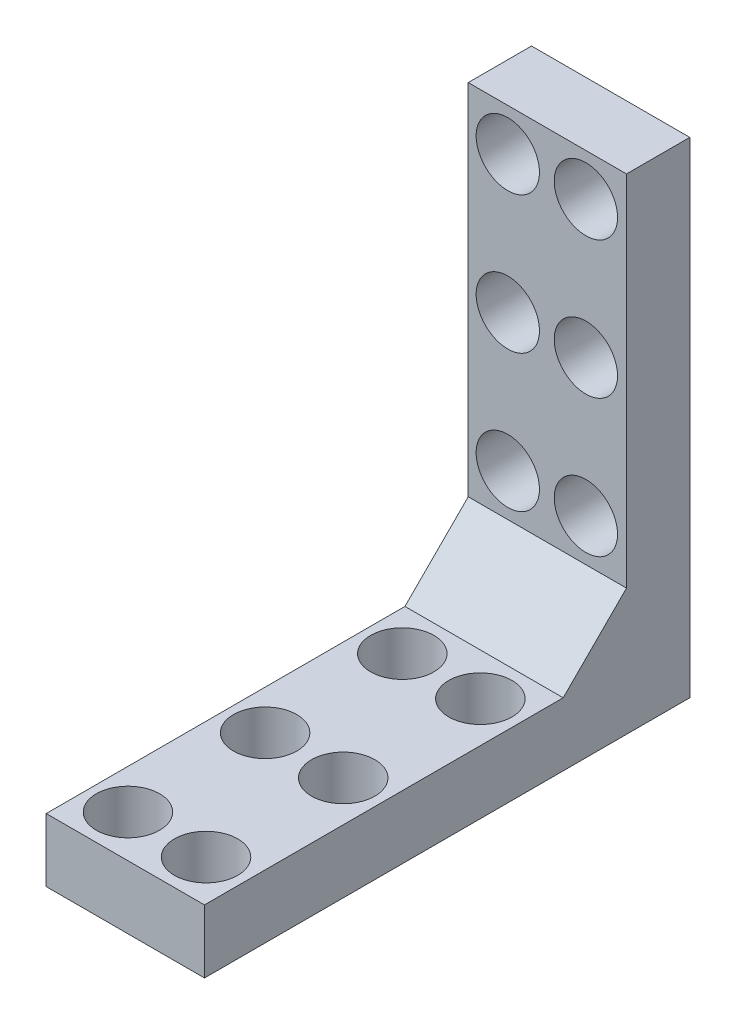
ISO-10303-21;
HEADER;
FILE_DESCRIPTION(('STEP AP214'),'2;1');
FILE_NAME('part.step','',(''),(''),'','','');
FILE_SCHEMA(('AUTOMOTIVE_DESIGN { 1 0 10303 214 1 1 1 1 }'));
ENDSEC;
DATA;
#1=APPLICATION_CONTEXT('core data for automotive mechanical design processes');
#2=APPLICATION_PROTOCOL_DEFINITION('international standard','automotive_design',2000,#1);
#3=PRODUCT_CONTEXT('',#1,'mechanical');
#4=PRODUCT('Part','Part','',(#3));
#5=PRODUCT_RELATED_PRODUCT_CATEGORY('part','',(#4));
#6=PRODUCT_DEFINITION_FORMATION('','',#4);
#7=PRODUCT_DEFINITION_CONTEXT('part definition',#1,'design');
#8=PRODUCT_DEFINITION('design','',#6,#7);
#9=PRODUCT_DEFINITION_SHAPE('','',#8);
#10=(LENGTH_UNIT() NAMED_UNIT(*) SI_UNIT(.MILLI.,.METRE.));
#11=(NAMED_UNIT(*) PLANE_ANGLE_UNIT() SI_UNIT($,.RADIAN.));
#12=(NAMED_UNIT(*) SI_UNIT($,.STERADIAN.) SOLID_ANGLE_UNIT());
#13=UNCERTAINTY_MEASURE_WITH_UNIT(LENGTH_MEASURE(1.E-05),#10,'distance_accuracy_value','');
#14=(GEOMETRIC_REPRESENTATION_CONTEXT(3) GLOBAL_UNCERTAINTY_ASSIGNED_CONTEXT((#13)) GLOBAL_UNIT_ASSIGNED_CONTEXT((#10,
#11,#12)) REPRESENTATION_CONTEXT('',''));
#15=CARTESIAN_POINT('',(0.,0.,0.));
#16=DIRECTION('',(0.,0.,1.));
#17=DIRECTION('',(1.,0.,0.));
#18=AXIS2_PLACEMENT_3D('',#15,#16,#17);
#19=CARTESIAN_POINT('',(5.575,-7.,-15.));
#20=DIRECTION('',(0.,1.,0.));
#21=DIRECTION('',(0.,0.,1.));
#22=AXIS2_PLACEMENT_3D('',#19,#20,#21);
#23=CYLINDRICAL_SURFACE('',#22,1.5);
#24=CARTESIAN_POINT('',(5.575,3.,-15.));
#25=DIRECTION('',(0.,1.,0.));
#26=DIRECTION('',(0.,0.,1.));
#27=AXIS2_PLACEMENT_3D('',#24,#25,#26);
#28=CIRCLE('',#27,1.5);
#29=CARTESIAN_POINT('',(5.575,3.,-13.5));
#30=VERTEX_POINT('',#29);
#31=EDGE_CURVE('E48',#30,#30,#28,.T.);
#32=ORIENTED_EDGE('',*,*,#31,.T.);
#33=EDGE_LOOP('',(#32));
#34=FACE_BOUND('',#33,.T.);
#35=CARTESIAN_POINT('',(5.575,0.,-15.));
#36=DIRECTION('',(0.,1.,0.));
#37=DIRECTION('',(0.,0.,1.));
#38=AXIS2_PLACEMENT_3D('',#35,#36,#37);
#39=CIRCLE('',#38,1.5);
#40=CARTESIAN_POINT('',(5.575,0.,-13.5));
#41=VERTEX_POINT('',#40);
#42=EDGE_CURVE('E11',#41,#41,#39,.T.);
#43=ORIENTED_EDGE('',*,*,#42,.F.);
#44=EDGE_LOOP('',(#43));
#45=FACE_BOUND('',#44,.T.);
#46=ADVANCED_FACE('F41',(#34,#45),#23,.F.);
#47=CARTESIAN_POINT('',(1.875,-7.,-15.));
#48=DIRECTION('',(0.,1.,0.));
#49=DIRECTION('',(0.,0.,1.));
#50=AXIS2_PLACEMENT_3D('',#47,#48,#49);
#51=CYLINDRICAL_SURFACE('',#50,1.5);
#52=CARTESIAN_POINT('',(1.875,3.,-15.));
#53=DIRECTION('',(0.,1.,0.));
#54=DIRECTION('',(0.,0.,1.));
#55=AXIS2_PLACEMENT_3D('',#52,#53,#54);
#56=CIRCLE('',#55,1.5);
#57=CARTESIAN_POINT('',(1.875,3.,-13.5));
#58=VERTEX_POINT('',#57);
#59=EDGE_CURVE('E176',#58,#58,#56,.T.);
#60=ORIENTED_EDGE('',*,*,#59,.T.);
#61=EDGE_LOOP('',(#60));
#62=FACE_BOUND('',#61,.T.);
#63=CARTESIAN_POINT('',(1.875,0.,-15.));
#64=DIRECTION('',(0.,1.,0.));
#65=DIRECTION('',(0.,0.,1.));
#66=AXIS2_PLACEMENT_3D('',#63,#64,#65);
#67=CIRCLE('',#66,1.5);
#68=CARTESIAN_POINT('',(1.875,0.,-13.5));
#69=VERTEX_POINT('',#68);
#70=EDGE_CURVE('E177',#69,#69,#67,.T.);
#71=ORIENTED_EDGE('',*,*,#70,.F.);
#72=EDGE_LOOP('',(#71));
#73=FACE_BOUND('',#72,.T.);
#74=ADVANCED_FACE('F206',(#62,#73),#51,.F.);
#75=CARTESIAN_POINT('',(5.575,-7.,-8.5));
#76=DIRECTION('',(0.,1.,0.));
#77=DIRECTION('',(0.,0.,1.));
#78=AXIS2_PLACEMENT_3D('',#75,#76,#77);
#79=CYLINDRICAL_SURFACE('',#78,1.5);
#80=CARTESIAN_POINT('',(5.575,3.,-8.5));
#81=DIRECTION('',(0.,1.,0.));
#82=DIRECTION('',(0.,0.,1.));
#83=AXIS2_PLACEMENT_3D('',#80,#81,#82);
#84=CIRCLE('',#83,1.5);
#85=CARTESIAN_POINT('',(5.575,3.,-7.));
#86=VERTEX_POINT('',#85);
#87=EDGE_CURVE('E168',#86,#86,#84,.T.);
#88=ORIENTED_EDGE('',*,*,#87,.T.);
#89=EDGE_LOOP('',(#88));
#90=FACE_BOUND('',#89,.T.);
#91=CARTESIAN_POINT('',(5.575,0.,-8.5));
#92=DIRECTION('',(0.,1.,0.));
#93=DIRECTION('',(0.,0.,1.));
#94=AXIS2_PLACEMENT_3D('',#91,#92,#93);
#95=CIRCLE('',#94,1.5);
#96=CARTESIAN_POINT('',(5.575,0.,-7.));
#97=VERTEX_POINT('',#96);
#98=EDGE_CURVE('E173',#97,#97,#95,.T.);
#99=ORIENTED_EDGE('',*,*,#98,.F.);
#100=EDGE_LOOP('',(#99));
#101=FACE_BOUND('',#100,.T.);
#102=ADVANCED_FACE('F211',(#90,#101),#79,.F.);
#103=CARTESIAN_POINT('',(1.875,-7.,-8.5));
#104=DIRECTION('',(0.,1.,0.));
#105=DIRECTION('',(0.,0.,1.));
#106=AXIS2_PLACEMENT_3D('',#103,#104,#105);
#107=CYLINDRICAL_SURFACE('',#106,1.5);
#108=CARTESIAN_POINT('',(1.875,3.,-8.5));
#109=DIRECTION('',(0.,1.,0.));
#110=DIRECTION('',(0.,0.,1.));
#111=AXIS2_PLACEMENT_3D('',#108,#109,#110);
#112=CIRCLE('',#111,1.5);
#113=CARTESIAN_POINT('',(1.875,3.,-7.));
#114=VERTEX_POINT('',#113);
#115=EDGE_CURVE('E163',#114,#114,#112,.T.);
#116=ORIENTED_EDGE('',*,*,#115,.T.);
#117=EDGE_LOOP('',(#116));
#118=FACE_BOUND('',#117,.T.);
#119=CARTESIAN_POINT('',(1.875,0.,-8.5));
#120=DIRECTION('',(0.,1.,0.));
#121=DIRECTION('',(0.,0.,1.));
#122=AXIS2_PLACEMENT_3D('',#119,#120,#121);
#123=CIRCLE('',#122,1.5);
#124=CARTESIAN_POINT('',(1.875,0.,-7.));
#125=VERTEX_POINT('',#124);
#126=EDGE_CURVE('E170',#125,#125,#123,.T.);
#127=ORIENTED_EDGE('',*,*,#126,.F.);
#128=EDGE_LOOP('',(#127));
#129=FACE_BOUND('',#128,.T.);
#130=ADVANCED_FACE('F216',(#118,#129),#107,.F.);
#131=CARTESIAN_POINT('',(5.575,8.,-30.));
#132=DIRECTION('',(0.,0.,1.));
#133=DIRECTION('',(1.,0.,0.));
#134=AXIS2_PLACEMENT_3D('',#131,#132,#133);
#135=CYLINDRICAL_SURFACE('',#134,1.5);
#136=CARTESIAN_POINT('',(5.575,8.,-20.));
#137=DIRECTION('',(0.,0.,1.));
#138=DIRECTION('',(1.,0.,0.));
#139=AXIS2_PLACEMENT_3D('',#136,#137,#138);
#140=CIRCLE('',#139,1.5);
#141=CARTESIAN_POINT('',(7.075,8.,-20.));
#142=VERTEX_POINT('',#141);
#143=EDGE_CURVE('E158',#142,#142,#140,.T.);
#144=ORIENTED_EDGE('',*,*,#143,.T.);
#145=EDGE_LOOP('',(#144));
#146=FACE_BOUND('',#145,.T.);
#147=CARTESIAN_POINT('',(5.575,8.,-23.));
#148=DIRECTION('',(0.,0.,1.));
#149=DIRECTION('',(0.,-1.,0.));
#150=AXIS2_PLACEMENT_3D('',#147,#148,#149);
#151=CIRCLE('',#150,1.5);
#152=CARTESIAN_POINT('',(5.575,6.5,-23.));
#153=VERTEX_POINT('',#152);
#154=EDGE_CURVE('E161',#153,#153,#151,.T.);
#155=ORIENTED_EDGE('',*,*,#154,.F.);
#156=EDGE_LOOP('',(#155));
#157=FACE_BOUND('',#156,.T.);
#158=ADVANCED_FACE('F224',(#146,#157),#135,.F.);
#159=CARTESIAN_POINT('',(1.875,8.,-30.));
#160=DIRECTION('',(0.,0.,1.));
#161=DIRECTION('',(1.,0.,0.));
#162=AXIS2_PLACEMENT_3D('',#159,#160,#161);
#163=CYLINDRICAL_SURFACE('',#162,1.5);
#164=CARTESIAN_POINT('',(1.875,8.,-20.));
#165=DIRECTION('',(0.,0.,1.));
#166=DIRECTION('',(1.,0.,0.));
#167=AXIS2_PLACEMENT_3D('',#164,#165,#166);
#168=CIRCLE('',#167,1.5);
#169=CARTESIAN_POINT('',(3.375,8.,-20.));
#170=VERTEX_POINT('',#169);
#171=EDGE_CURVE('E155',#170,#170,#168,.T.);
#172=ORIENTED_EDGE('',*,*,#171,.T.);
#173=EDGE_LOOP('',(#172));
#174=FACE_BOUND('',#173,.T.);
#175=CARTESIAN_POINT('',(1.875,8.,-23.));
#176=DIRECTION('',(0.,0.,1.));
#177=DIRECTION('',(0.,-1.,0.));
#178=AXIS2_PLACEMENT_3D('',#175,#176,#177);
#179=CIRCLE('',#178,1.5);
#180=CARTESIAN_POINT('',(1.875,6.5,-23.));
#181=VERTEX_POINT('',#180);
#182=EDGE_CURVE('E154',#181,#181,#179,.T.);
#183=ORIENTED_EDGE('',*,*,#182,.F.);
#184=EDGE_LOOP('',(#183));
#185=FACE_BOUND('',#184,.T.);
#186=ADVANCED_FACE('F230',(#174,#185),#163,.F.);
#187=CARTESIAN_POINT('',(5.575,14.5,-30.));
#188=DIRECTION('',(0.,0.,1.));
#189=DIRECTION('',(1.,0.,0.));
#190=AXIS2_PLACEMENT_3D('',#187,#188,#189);
#191=CYLINDRICAL_SURFACE('',#190,1.5);
#192=CARTESIAN_POINT('',(5.575,14.5,-20.));
#193=DIRECTION('',(0.,0.,1.));
#194=DIRECTION('',(1.,0.,0.));
#195=AXIS2_PLACEMENT_3D('',#192,#193,#194);
#196=CIRCLE('',#195,1.5);
#197=CARTESIAN_POINT('',(7.075,14.5,-20.));
#198=VERTEX_POINT('',#197);
#199=EDGE_CURVE('E148',#198,#198,#196,.T.);
#200=ORIENTED_EDGE('',*,*,#199,.T.);
#201=EDGE_LOOP('',(#200));
#202=FACE_BOUND('',#201,.T.);
#203=CARTESIAN_POINT('',(5.575,14.5,-23.));
#204=DIRECTION('',(0.,0.,1.));
#205=DIRECTION('',(0.,-1.,0.));
#206=AXIS2_PLACEMENT_3D('',#203,#204,#205);
#207=CIRCLE('',#206,1.5);
#208=CARTESIAN_POINT('',(5.575,13.,-23.));
#209=VERTEX_POINT('',#208);
#210=EDGE_CURVE('E149',#209,#209,#207,.T.);
#211=ORIENTED_EDGE('',*,*,#210,.F.);
#212=EDGE_LOOP('',(#211));
#213=FACE_BOUND('',#212,.T.);
#214=ADVANCED_FACE('F231',(#202,#213),#191,.F.);
#215=CARTESIAN_POINT('',(1.875,14.5,-30.));
#216=DIRECTION('',(0.,0.,1.));
#217=DIRECTION('',(1.,0.,0.));
#218=AXIS2_PLACEMENT_3D('',#215,#216,#217);
#219=CYLINDRICAL_SURFACE('',#218,1.5);
#220=CARTESIAN_POINT('',(1.875,14.5,-20.));
#221=DIRECTION('',(0.,0.,1.));
#222=DIRECTION('',(1.,0.,0.));
#223=AXIS2_PLACEMENT_3D('',#220,#221,#222);
#224=CIRCLE('',#223,1.5);
#225=CARTESIAN_POINT('',(3.375,14.5,-20.));
#226=VERTEX_POINT('',#225);
#227=EDGE_CURVE('E139',#226,#226,#224,.T.);
#228=ORIENTED_EDGE('',*,*,#227,.T.);
#229=EDGE_LOOP('',(#228));
#230=FACE_BOUND('',#229,.T.);
#231=CARTESIAN_POINT('',(1.875,14.5,-23.));
#232=DIRECTION('',(0.,0.,1.));
#233=DIRECTION('',(0.,-1.,0.));
#234=AXIS2_PLACEMENT_3D('',#231,#232,#233);
#235=CIRCLE('',#234,1.5);
#236=CARTESIAN_POINT('',(1.875,13.,-23.));
#237=VERTEX_POINT('',#236);
#238=EDGE_CURVE('E141',#237,#237,#235,.T.);
#239=ORIENTED_EDGE('',*,*,#238,.F.);
#240=EDGE_LOOP('',(#239));
#241=FACE_BOUND('',#240,.T.);
#242=ADVANCED_FACE('F234',(#230,#241),#219,.F.);
#243=CARTESIAN_POINT('',(7.5,0.,0.));
#244=DIRECTION('',(0.,1.,0.));
#245=DIRECTION('',(0.,0.,1.));
#246=AXIS2_PLACEMENT_3D('',#243,#244,#245);
#247=PLANE('',#246);
#248=CARTESIAN_POINT('',(5.575,0.,-2.));
#249=DIRECTION('',(0.,1.,0.));
#250=DIRECTION('',(0.,0.,1.));
#251=AXIS2_PLACEMENT_3D('',#248,#249,#250);
#252=CIRCLE('',#251,1.5);
#253=CARTESIAN_POINT('',(5.575,0.,-0.5));
#254=VERTEX_POINT('',#253);
#255=EDGE_CURVE('E308',#254,#254,#252,.T.);
#256=ORIENTED_EDGE('',*,*,#255,.T.);
#257=EDGE_LOOP('',(#256));
#258=FACE_BOUND('',#257,.T.);
#259=CARTESIAN_POINT('',(1.875,0.,-2.));
#260=DIRECTION('',(0.,1.,0.));
#261=DIRECTION('',(0.,0.,1.));
#262=AXIS2_PLACEMENT_3D('',#259,#260,#261);
#263=CIRCLE('',#262,1.5);
#264=CARTESIAN_POINT('',(1.875,0.,-0.5));
#265=VERTEX_POINT('',#264);
#266=EDGE_CURVE('E294',#265,#265,#263,.T.);
#267=ORIENTED_EDGE('',*,*,#266,.T.);
#268=EDGE_LOOP('',(#267));
#269=FACE_BOUND('',#268,.T.);
#270=DIRECTION('',(0.,0.,-1.));
#271=VECTOR('',#270,1.);
#272=CARTESIAN_POINT('',(0.,0.,0.));
#273=LINE('',#272,#271);
#274=CARTESIAN_POINT('',(0.,0.,0.));
#275=VERTEX_POINT('',#274);
#276=CARTESIAN_POINT('',(0.,0.,-23.));
#277=VERTEX_POINT('',#276);
#278=EDGE_CURVE('E130',#275,#277,#273,.T.);
#279=ORIENTED_EDGE('',*,*,#278,.T.);
#280=DIRECTION('',(-1.,0.,0.));
#281=VECTOR('',#280,1.);
#282=CARTESIAN_POINT('',(7.5,0.,-23.));
#283=LINE('',#282,#281);
#284=CARTESIAN_POINT('',(7.5,0.,-23.));
#285=VERTEX_POINT('',#284);
#286=EDGE_CURVE('E106',#285,#277,#283,.T.);
#287=ORIENTED_EDGE('',*,*,#286,.F.);
#288=DIRECTION('',(0.,0.,-1.));
#289=VECTOR('',#288,1.);
#290=CARTESIAN_POINT('',(7.5,0.,0.));
#291=LINE('',#290,#289);
#292=CARTESIAN_POINT('',(7.5,0.,0.));
#293=VERTEX_POINT('',#292);
#294=EDGE_CURVE('E114',#293,#285,#291,.T.);
#295=ORIENTED_EDGE('',*,*,#294,.F.);
#296=DIRECTION('',(-1.,0.,0.));
#297=VECTOR('',#296,1.);
#298=CARTESIAN_POINT('',(7.5,0.,0.));
#299=LINE('',#298,#297);
#300=EDGE_CURVE('E273',#293,#275,#299,.T.);
#301=ORIENTED_EDGE('',*,*,#300,.T.);
#302=EDGE_LOOP('',(#279,#287,#295,#301));
#303=FACE_BOUND('',#302,.T.);
#304=ORIENTED_EDGE('',*,*,#126,.T.);
#305=EDGE_LOOP('',(#304));
#306=FACE_BOUND('',#305,.T.);
#307=ORIENTED_EDGE('',*,*,#98,.T.);
#308=EDGE_LOOP('',(#307));
#309=FACE_BOUND('',#308,.T.);
#310=ORIENTED_EDGE('',*,*,#70,.T.);
#311=EDGE_LOOP('',(#310));
#312=FACE_BOUND('',#311,.T.);
#313=ORIENTED_EDGE('',*,*,#42,.T.);
#314=EDGE_LOOP('',(#313));
#315=FACE_BOUND('',#314,.T.);
#316=ADVANCED_FACE('F122',(#258,#269,#303,#306,#309,#312,#315),#247,.F.);
#317=CARTESIAN_POINT('',(7.5,0.,-23.));
#318=DIRECTION('',(0.,0.,1.));
#319=DIRECTION('',(0.,-1.,0.));
#320=AXIS2_PLACEMENT_3D('',#317,#318,#319);
#321=PLANE('',#320);
#322=CARTESIAN_POINT('',(5.575,21.,-23.));
#323=DIRECTION('',(0.,0.,1.));
#324=DIRECTION('',(0.,-1.,0.));
#325=AXIS2_PLACEMENT_3D('',#322,#323,#324);
#326=CIRCLE('',#325,1.5);
#327=CARTESIAN_POINT('',(5.575,19.5,-23.));
#328=VERTEX_POINT('',#327);
#329=EDGE_CURVE('E296',#328,#328,#326,.T.);
#330=ORIENTED_EDGE('',*,*,#329,.T.);
#331=EDGE_LOOP('',(#330));
#332=FACE_BOUND('',#331,.T.);
#333=CARTESIAN_POINT('',(1.875,21.,-23.));
#334=DIRECTION('',(0.,0.,1.));
#335=DIRECTION('',(0.,-1.,0.));
#336=AXIS2_PLACEMENT_3D('',#333,#334,#335);
#337=CIRCLE('',#336,1.5);
#338=CARTESIAN_POINT('',(1.875,19.5,-23.));
#339=VERTEX_POINT('',#338);
#340=EDGE_CURVE('E282',#339,#339,#337,.T.);
#341=ORIENTED_EDGE('',*,*,#340,.T.);
#342=EDGE_LOOP('',(#341));
#343=FACE_BOUND('',#342,.T.);
#344=DIRECTION('',(0.,1.,0.));
#345=VECTOR('',#344,1.);
#346=CARTESIAN_POINT('',(0.,0.,-23.));
#347=LINE('',#346,#345);
#348=CARTESIAN_POINT('',(0.,23.,-23.));
#349=VERTEX_POINT('',#348);
#350=EDGE_CURVE('E263',#277,#349,#347,.T.);
#351=ORIENTED_EDGE('',*,*,#350,.T.);
#352=DIRECTION('',(-1.,0.,0.));
#353=VECTOR('',#352,1.);
#354=CARTESIAN_POINT('',(7.5,23.,-23.));
#355=LINE('',#354,#353);
#356=CARTESIAN_POINT('',(7.5,23.,-23.));
#357=VERTEX_POINT('',#356);
#358=EDGE_CURVE('E108',#357,#349,#355,.T.);
#359=ORIENTED_EDGE('',*,*,#358,.F.);
#360=DIRECTION('',(0.,1.,0.));
#361=VECTOR('',#360,1.);
#362=CARTESIAN_POINT('',(7.5,0.,-23.));
#363=LINE('',#362,#361);
#364=EDGE_CURVE('E101',#285,#357,#363,.T.);
#365=ORIENTED_EDGE('',*,*,#364,.F.);
#366=ORIENTED_EDGE('',*,*,#286,.T.);
#367=EDGE_LOOP('',(#351,#359,#365,#366));
#368=FACE_BOUND('',#367,.T.);
#369=ORIENTED_EDGE('',*,*,#238,.T.);
#370=EDGE_LOOP('',(#369));
#371=FACE_BOUND('',#370,.T.);
#372=ORIENTED_EDGE('',*,*,#210,.T.);
#373=EDGE_LOOP('',(#372));
#374=FACE_BOUND('',#373,.T.);
#375=ORIENTED_EDGE('',*,*,#182,.T.);
#376=EDGE_LOOP('',(#375));
#377=FACE_BOUND('',#376,.T.);
#378=ORIENTED_EDGE('',*,*,#154,.T.);
#379=EDGE_LOOP('',(#378));
#380=FACE_BOUND('',#379,.T.);
#381=ADVANCED_FACE('F103',(#332,#343,#368,#371,#374,#377,#380),#321,.F.);
#382=CARTESIAN_POINT('',(7.5,23.,-23.));
#383=DIRECTION('',(0.,-1.,0.));
#384=DIRECTION('',(0.,0.,-1.));
#385=AXIS2_PLACEMENT_3D('',#382,#383,#384);
#386=PLANE('',#385);
#387=DIRECTION('',(0.,0.,1.));
#388=VECTOR('',#387,1.);
#389=CARTESIAN_POINT('',(0.,23.,-23.));
#390=LINE('',#389,#388);
#391=CARTESIAN_POINT('',(0.,23.,-20.));
#392=VERTEX_POINT('',#391);
#393=EDGE_CURVE('E257',#349,#392,#390,.T.);
#394=ORIENTED_EDGE('',*,*,#393,.T.);
#395=DIRECTION('',(-1.,0.,0.));
#396=VECTOR('',#395,1.);
#397=CARTESIAN_POINT('',(7.5,23.,-20.));
#398=LINE('',#397,#396);
#399=CARTESIAN_POINT('',(7.5,23.,-20.));
#400=VERTEX_POINT('',#399);
#401=EDGE_CURVE('E135',#400,#392,#398,.T.);
#402=ORIENTED_EDGE('',*,*,#401,.F.);
#403=DIRECTION('',(0.,0.,1.));
#404=VECTOR('',#403,1.);
#405=CARTESIAN_POINT('',(7.5,23.,-23.));
#406=LINE('',#405,#404);
#407=EDGE_CURVE('E115',#357,#400,#406,.T.);
#408=ORIENTED_EDGE('',*,*,#407,.F.);
#409=ORIENTED_EDGE('',*,*,#358,.T.);
#410=EDGE_LOOP('',(#394,#402,#408,#409));
#411=FACE_BOUND('',#410,.T.);
#412=ADVANCED_FACE('F199',(#411),#386,.F.);
#413=CARTESIAN_POINT('',(7.5,3.,-20.));
#414=DIRECTION('',(0.,0.,-1.));
#415=DIRECTION('',(0.,1.,0.));
#416=AXIS2_PLACEMENT_3D('',#413,#414,#415);
#417=PLANE('',#416);
#418=CARTESIAN_POINT('',(5.575,21.,-20.));
#419=DIRECTION('',(0.,0.,1.));
#420=DIRECTION('',(1.,0.,0.));
#421=AXIS2_PLACEMENT_3D('',#418,#419,#420);
#422=CIRCLE('',#421,1.5);
#423=CARTESIAN_POINT('',(7.075,21.,-20.));
#424=VERTEX_POINT('',#423);
#425=EDGE_CURVE('E303',#424,#424,#422,.T.);
#426=ORIENTED_EDGE('',*,*,#425,.F.);
#427=EDGE_LOOP('',(#426));
#428=FACE_BOUND('',#427,.T.);
#429=CARTESIAN_POINT('',(1.875,21.,-20.));
#430=DIRECTION('',(0.,0.,1.));
#431=DIRECTION('',(1.,0.,0.));
#432=AXIS2_PLACEMENT_3D('',#429,#430,#431);
#433=CIRCLE('',#432,1.5);
#434=CARTESIAN_POINT('',(3.375,21.,-20.));
#435=VERTEX_POINT('',#434);
#436=EDGE_CURVE('E284',#435,#435,#433,.T.);
#437=ORIENTED_EDGE('',*,*,#436,.F.);
#438=EDGE_LOOP('',(#437));
#439=FACE_BOUND('',#438,.T.);
#440=DIRECTION('',(0.,-1.,0.));
#441=VECTOR('',#440,1.);
#442=CARTESIAN_POINT('',(0.,3.,-20.));
#443=LINE('',#442,#441);
#444=CARTESIAN_POINT('',(0.,5.99999999999999,-20.));
#445=VERTEX_POINT('',#444);
#446=EDGE_CURVE('E265',#392,#445,#443,.T.);
#447=ORIENTED_EDGE('',*,*,#446,.T.);
#448=DIRECTION('',(1.,0.,0.));
#449=VECTOR('',#448,1.);
#450=CARTESIAN_POINT('',(7.5,5.99999999999999,-20.));
#451=LINE('',#450,#449);
#452=CARTESIAN_POINT('',(7.5,5.99999999999999,-20.));
#453=VERTEX_POINT('',#452);
#454=EDGE_CURVE('E54',#445,#453,#451,.T.);
#455=ORIENTED_EDGE('',*,*,#454,.T.);
#456=DIRECTION('',(0.,-1.,0.));
#457=VECTOR('',#456,1.);
#458=CARTESIAN_POINT('',(7.5,3.,-20.));
#459=LINE('',#458,#457);
#460=EDGE_CURVE('E266',#400,#453,#459,.T.);
#461=ORIENTED_EDGE('',*,*,#460,.F.);
#462=ORIENTED_EDGE('',*,*,#401,.T.);
#463=EDGE_LOOP('',(#447,#455,#461,#462));
#464=FACE_BOUND('',#463,.T.);
#465=ORIENTED_EDGE('',*,*,#227,.F.);
#466=EDGE_LOOP('',(#465));
#467=FACE_BOUND('',#466,.T.);
#468=ORIENTED_EDGE('',*,*,#199,.F.);
#469=EDGE_LOOP('',(#468));
#470=FACE_BOUND('',#469,.T.);
#471=ORIENTED_EDGE('',*,*,#171,.F.);
#472=EDGE_LOOP('',(#471));
#473=FACE_BOUND('',#472,.T.);
#474=ORIENTED_EDGE('',*,*,#143,.F.);
#475=EDGE_LOOP('',(#474));
#476=FACE_BOUND('',#475,.T.);
#477=ADVANCED_FACE('F189',(#428,#439,#464,#467,#470,#473,#476),#417,.F.);
#478=CARTESIAN_POINT('',(7.5,3.,0.));
#479=DIRECTION('',(0.,-1.,0.));
#480=DIRECTION('',(0.,0.,-1.));
#481=AXIS2_PLACEMENT_3D('',#478,#479,#480);
#482=PLANE('',#481);
#483=CARTESIAN_POINT('',(5.575,3.,-2.));
#484=DIRECTION('',(0.,1.,0.));
#485=DIRECTION('',(0.,0.,1.));
#486=AXIS2_PLACEMENT_3D('',#483,#484,#485);
#487=CIRCLE('',#486,1.5);
#488=CARTESIAN_POINT('',(5.575,3.,-0.5));
#489=VERTEX_POINT('',#488);
#490=EDGE_CURVE('E310',#489,#489,#487,.T.);
#491=ORIENTED_EDGE('',*,*,#490,.F.);
#492=EDGE_LOOP('',(#491));
#493=FACE_BOUND('',#492,.T.);
#494=CARTESIAN_POINT('',(1.875,3.,-2.));
#495=DIRECTION('',(0.,1.,0.));
#496=DIRECTION('',(0.,0.,1.));
#497=AXIS2_PLACEMENT_3D('',#494,#495,#496);
#498=CIRCLE('',#497,1.5);
#499=CARTESIAN_POINT('',(1.875,3.,-0.5));
#500=VERTEX_POINT('',#499);
#501=EDGE_CURVE('E300',#500,#500,#498,.T.);
#502=ORIENTED_EDGE('',*,*,#501,.F.);
#503=EDGE_LOOP('',(#502));
#504=FACE_BOUND('',#503,.T.);
#505=DIRECTION('',(0.,0.,1.));
#506=VECTOR('',#505,1.);
#507=CARTESIAN_POINT('',(7.5,3.,0.));
#508=LINE('',#507,#506);
#509=CARTESIAN_POINT('',(7.5,3.,-17.));
#510=VERTEX_POINT('',#509);
#511=CARTESIAN_POINT('',(7.5,3.,0.));
#512=VERTEX_POINT('',#511);
#513=EDGE_CURVE('E288',#510,#512,#508,.T.);
#514=ORIENTED_EDGE('',*,*,#513,.F.);
#515=DIRECTION('',(-1.,0.,0.));
#516=VECTOR('',#515,1.);
#517=CARTESIAN_POINT('',(0.,3.,-17.));
#518=LINE('',#517,#516);
#519=CARTESIAN_POINT('',(0.,3.,-17.));
#520=VERTEX_POINT('',#519);
#521=EDGE_CURVE('E126',#510,#520,#518,.T.);
#522=ORIENTED_EDGE('',*,*,#521,.T.);
#523=DIRECTION('',(0.,0.,1.));
#524=VECTOR('',#523,1.);
#525=CARTESIAN_POINT('',(0.,3.,0.));
#526=LINE('',#525,#524);
#527=CARTESIAN_POINT('',(0.,3.,0.));
#528=VERTEX_POINT('',#527);
#529=EDGE_CURVE('E268',#520,#528,#526,.T.);
#530=ORIENTED_EDGE('',*,*,#529,.T.);
#531=DIRECTION('',(-1.,0.,0.));
#532=VECTOR('',#531,1.);
#533=CARTESIAN_POINT('',(7.5,3.,0.));
#534=LINE('',#533,#532);
#535=EDGE_CURVE('E270',#512,#528,#534,.T.);
#536=ORIENTED_EDGE('',*,*,#535,.F.);
#537=EDGE_LOOP('',(#514,#522,#530,#536));
#538=FACE_BOUND('',#537,.T.);
#539=ORIENTED_EDGE('',*,*,#115,.F.);
#540=EDGE_LOOP('',(#539));
#541=FACE_BOUND('',#540,.T.);
#542=ORIENTED_EDGE('',*,*,#87,.F.);
#543=EDGE_LOOP('',(#542));
#544=FACE_BOUND('',#543,.T.);
#545=ORIENTED_EDGE('',*,*,#59,.F.);
#546=EDGE_LOOP('',(#545));
#547=FACE_BOUND('',#546,.T.);
#548=ORIENTED_EDGE('',*,*,#31,.F.);
#549=EDGE_LOOP('',(#548));
#550=FACE_BOUND('',#549,.T.);
#551=ADVANCED_FACE('F187',(#493,#504,#538,#541,#544,#547,#550),#482,.F.);
#552=CARTESIAN_POINT('',(7.5,0.,0.));
#553=DIRECTION('',(0.,0.,-1.));
#554=DIRECTION('',(-1.,0.,0.));
#555=AXIS2_PLACEMENT_3D('',#552,#553,#554);
#556=PLANE('',#555);
#557=DIRECTION('',(0.,-1.,0.));
#558=VECTOR('',#557,1.);
#559=CARTESIAN_POINT('',(0.,0.,0.));
#560=LINE('',#559,#558);
#561=EDGE_CURVE('E125',#528,#275,#560,.T.);
#562=ORIENTED_EDGE('',*,*,#561,.T.);
#563=ORIENTED_EDGE('',*,*,#300,.F.);
#564=DIRECTION('',(0.,-1.,0.));
#565=VECTOR('',#564,1.);
#566=CARTESIAN_POINT('',(7.5,0.,0.));
#567=LINE('',#566,#565);
#568=EDGE_CURVE('E118',#512,#293,#567,.T.);
#569=ORIENTED_EDGE('',*,*,#568,.F.);
#570=ORIENTED_EDGE('',*,*,#535,.T.);
#571=EDGE_LOOP('',(#562,#563,#569,#570));
#572=FACE_BOUND('',#571,.T.);
#573=ADVANCED_FACE('F188',(#572),#556,.F.);
#574=CARTESIAN_POINT('',(7.5,0.,0.));
#575=DIRECTION('',(1.,0.,0.));
#576=DIRECTION('',(0.,0.,-1.));
#577=AXIS2_PLACEMENT_3D('',#574,#575,#576);
#578=PLANE('',#577);
#579=ORIENTED_EDGE('',*,*,#294,.T.);
#580=ORIENTED_EDGE('',*,*,#364,.T.);
#581=ORIENTED_EDGE('',*,*,#407,.T.);
#582=ORIENTED_EDGE('',*,*,#460,.T.);
#583=DIRECTION('',(0.,0.707106781186544,-0.707106781186551));
#584=VECTOR('',#583,1.);
#585=CARTESIAN_POINT('',(7.5,3.,-17.));
#586=LINE('',#585,#584);
#587=EDGE_CURVE('E138',#453,#510,#586,.F.);
#588=ORIENTED_EDGE('',*,*,#587,.T.);
#589=ORIENTED_EDGE('',*,*,#513,.T.);
#590=ORIENTED_EDGE('',*,*,#568,.T.);
#591=EDGE_LOOP('',(#579,#580,#581,#582,#588,#589,#590));
#592=FACE_BOUND('',#591,.T.);
#593=ADVANCED_FACE('F117',(#592),#578,.T.);
#594=CARTESIAN_POINT('',(0.,0.,0.));
#595=DIRECTION('',(1.,0.,0.));
#596=DIRECTION('',(0.,0.,-1.));
#597=AXIS2_PLACEMENT_3D('',#594,#595,#596);
#598=PLANE('',#597);
#599=ORIENTED_EDGE('',*,*,#278,.F.);
#600=ORIENTED_EDGE('',*,*,#561,.F.);
#601=ORIENTED_EDGE('',*,*,#529,.F.);
#602=DIRECTION('',(0.,-0.707106781186544,0.707106781186551));
#603=VECTOR('',#602,1.);
#604=CARTESIAN_POINT('',(0.,-6.99999999999998,-6.9999999999999));
#605=LINE('',#604,#603);
#606=EDGE_CURVE('E63',#520,#445,#605,.F.);
#607=ORIENTED_EDGE('',*,*,#606,.T.);
#608=ORIENTED_EDGE('',*,*,#446,.F.);
#609=ORIENTED_EDGE('',*,*,#393,.F.);
#610=ORIENTED_EDGE('',*,*,#350,.F.);
#611=EDGE_LOOP('',(#599,#600,#601,#607,#608,#609,#610));
#612=FACE_BOUND('',#611,.T.);
#613=ADVANCED_FACE('F250',(#612),#598,.F.);
#614=CARTESIAN_POINT('',(7.5,3.,-17.));
#615=DIRECTION('',(0.,0.707106781186551,0.707106781186544));
#616=DIRECTION('',(1.,0.,0.));
#617=AXIS2_PLACEMENT_3D('',#614,#615,#616);
#618=PLANE('',#617);
#619=ORIENTED_EDGE('',*,*,#587,.F.);
#620=ORIENTED_EDGE('',*,*,#454,.F.);
#621=ORIENTED_EDGE('',*,*,#606,.F.);
#622=ORIENTED_EDGE('',*,*,#521,.F.);
#623=EDGE_LOOP('',(#619,#620,#621,#622));
#624=FACE_BOUND('',#623,.T.);
#625=ADVANCED_FACE('F242',(#624),#618,.T.);
#626=CARTESIAN_POINT('',(1.875,21.,-30.));
#627=DIRECTION('',(0.,0.,1.));
#628=DIRECTION('',(1.,0.,0.));
#629=AXIS2_PLACEMENT_3D('',#626,#627,#628);
#630=CYLINDRICAL_SURFACE('',#629,1.5);
#631=ORIENTED_EDGE('',*,*,#436,.T.);
#632=EDGE_LOOP('',(#631));
#633=FACE_BOUND('',#632,.T.);
#634=ORIENTED_EDGE('',*,*,#340,.F.);
#635=EDGE_LOOP('',(#634));
#636=FACE_BOUND('',#635,.T.);
#637=ADVANCED_FACE('F246',(#633,#636),#630,.F.);
#638=CARTESIAN_POINT('',(1.875,-7.,-2.));
#639=DIRECTION('',(0.,1.,0.));
#640=DIRECTION('',(0.,0.,1.));
#641=AXIS2_PLACEMENT_3D('',#638,#639,#640);
#642=CYLINDRICAL_SURFACE('',#641,1.5);
#643=ORIENTED_EDGE('',*,*,#501,.T.);
#644=EDGE_LOOP('',(#643));
#645=FACE_BOUND('',#644,.T.);
#646=ORIENTED_EDGE('',*,*,#266,.F.);
#647=EDGE_LOOP('',(#646));
#648=FACE_BOUND('',#647,.T.);
#649=ADVANCED_FACE('F319',(#645,#648),#642,.F.);
#650=CARTESIAN_POINT('',(5.575,21.,-30.));
#651=DIRECTION('',(0.,0.,1.));
#652=DIRECTION('',(1.,0.,0.));
#653=AXIS2_PLACEMENT_3D('',#650,#651,#652);
#654=CYLINDRICAL_SURFACE('',#653,1.5);
#655=ORIENTED_EDGE('',*,*,#425,.T.);
#656=EDGE_LOOP('',(#655));
#657=FACE_BOUND('',#656,.T.);
#658=ORIENTED_EDGE('',*,*,#329,.F.);
#659=EDGE_LOOP('',(#658));
#660=FACE_BOUND('',#659,.T.);
#661=ADVANCED_FACE('F314',(#657,#660),#654,.F.);
#662=CARTESIAN_POINT('',(5.575,-7.,-2.));
#663=DIRECTION('',(0.,1.,0.));
#664=DIRECTION('',(0.,0.,1.));
#665=AXIS2_PLACEMENT_3D('',#662,#663,#664);
#666=CYLINDRICAL_SURFACE('',#665,1.5);
#667=ORIENTED_EDGE('',*,*,#490,.T.);
#668=EDGE_LOOP('',(#667));
#669=FACE_BOUND('',#668,.T.);
#670=ORIENTED_EDGE('',*,*,#255,.F.);
#671=EDGE_LOOP('',(#670));
#672=FACE_BOUND('',#671,.T.);
#673=ADVANCED_FACE('F315',(#669,#672),#666,.F.);
#674=CLOSED_SHELL('',(#46,#74,#102,#130,#158,#186,#214,#242,#316,#381,#412,#477,#551,#573,#593,
#613,#625,#637,#649,#661,#673));
#675=MANIFOLD_SOLID_BREP('B2',#674);
#676=ADVANCED_BREP_SHAPE_REPRESENTATION('',(#18,#675),#14);
#677=SHAPE_DEFINITION_REPRESENTATION(#9,#676);
ENDSEC;
END-ISO-10303-21;
